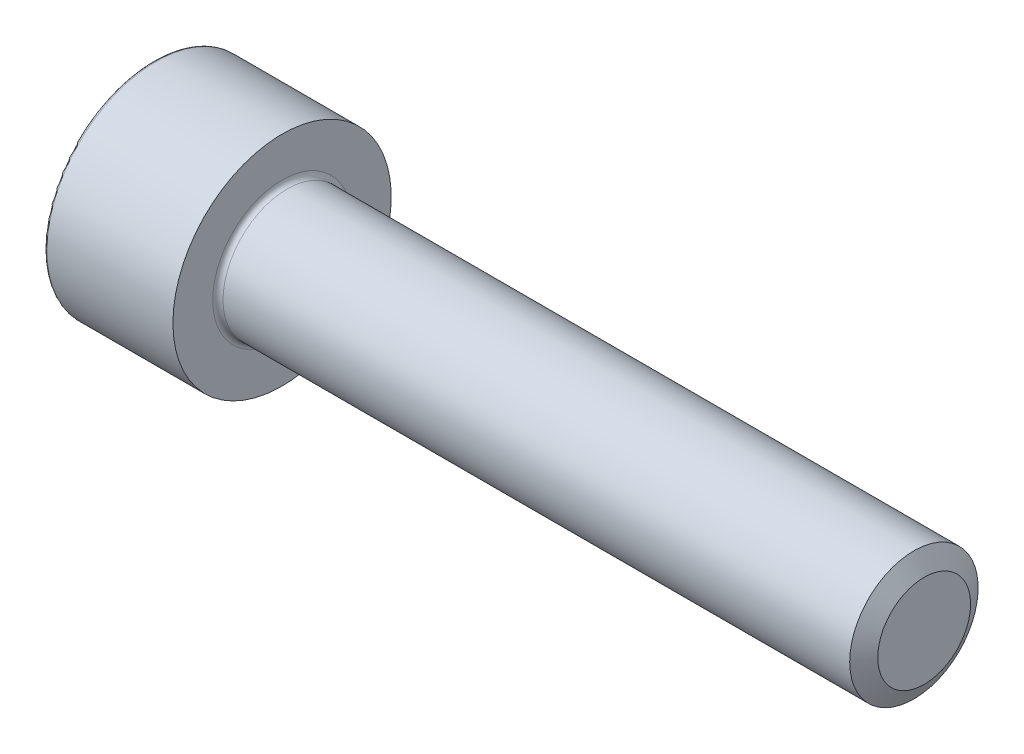
ISO-10303-21;
HEADER;
FILE_DESCRIPTION(('STEP AP214'),'2;1');
FILE_NAME('part.step','',(''),(''),'','','');
FILE_SCHEMA(('AUTOMOTIVE_DESIGN { 1 0 10303 214 1 1 1 1 }'));
ENDSEC;
DATA;
#1=APPLICATION_CONTEXT('core data for automotive mechanical design processes');
#2=APPLICATION_PROTOCOL_DEFINITION('international standard','automotive_design',2000,#1);
#3=PRODUCT_CONTEXT('',#1,'mechanical');
#4=PRODUCT('Part','Part','',(#3));
#5=PRODUCT_RELATED_PRODUCT_CATEGORY('part','',(#4));
#6=PRODUCT_DEFINITION_FORMATION('','',#4);
#7=PRODUCT_DEFINITION_CONTEXT('part definition',#1,'design');
#8=PRODUCT_DEFINITION('design','',#6,#7);
#9=PRODUCT_DEFINITION_SHAPE('','',#8);
#10=(LENGTH_UNIT() NAMED_UNIT(*) SI_UNIT(.MILLI.,.METRE.));
#11=(NAMED_UNIT(*) PLANE_ANGLE_UNIT() SI_UNIT($,.RADIAN.));
#12=(NAMED_UNIT(*) SI_UNIT($,.STERADIAN.) SOLID_ANGLE_UNIT());
#13=UNCERTAINTY_MEASURE_WITH_UNIT(LENGTH_MEASURE(1.E-05),#10,'distance_accuracy_value','');
#14=(GEOMETRIC_REPRESENTATION_CONTEXT(3) GLOBAL_UNCERTAINTY_ASSIGNED_CONTEXT((#13)) GLOBAL_UNIT_ASSIGNED_CONTEXT((#10,
#11,#12)) REPRESENTATION_CONTEXT('',''));
#15=CARTESIAN_POINT('',(0.,0.,0.));
#16=DIRECTION('',(0.,0.,1.));
#17=DIRECTION('',(1.,0.,0.));
#18=AXIS2_PLACEMENT_3D('',#15,#16,#17);
#19=CARTESIAN_POINT('',(0.,0.,0.));
#20=DIRECTION('',(-1.,0.,0.));
#21=DIRECTION('',(0.,0.,1.));
#22=AXIS2_PLACEMENT_3D('',#19,#20,#21);
#23=CYLINDRICAL_SURFACE('',#22,2.5);
#24=CARTESIAN_POINT('',(5.2,0.,0.));
#25=DIRECTION('',(-1.,0.,0.));
#26=DIRECTION('',(0.,0.,1.));
#27=AXIS2_PLACEMENT_3D('',#24,#25,#26);
#28=CIRCLE('',#27,2.5);
#29=CARTESIAN_POINT('',(5.2,0.,2.5));
#30=VERTEX_POINT('',#29);
#31=EDGE_CURVE('E142',#30,#30,#28,.T.);
#32=ORIENTED_EDGE('',*,*,#31,.F.);
#33=EDGE_LOOP('',(#32));
#34=FACE_BOUND('',#33,.T.);
#35=CARTESIAN_POINT('',(29.6000117335054,0.,0.));
#36=DIRECTION('',(-1.,0.,0.));
#37=DIRECTION('',(0.,0.,1.));
#38=AXIS2_PLACEMENT_3D('',#35,#36,#37);
#39=CIRCLE('',#38,2.5);
#40=CARTESIAN_POINT('',(29.6000117335054,0.,2.5));
#41=VERTEX_POINT('',#40);
#42=EDGE_CURVE('E279',#41,#41,#39,.T.);
#43=ORIENTED_EDGE('',*,*,#42,.T.);
#44=EDGE_LOOP('',(#43));
#45=FACE_BOUND('',#44,.T.);
#46=ADVANCED_FACE('F39',(#34,#45),#23,.T.);
#47=CARTESIAN_POINT('',(0.,0.,0.));
#48=DIRECTION('',(1.,0.,0.));
#49=DIRECTION('',(0.,0.,-1.));
#50=AXIS2_PLACEMENT_3D('',#47,#48,#49);
#51=PLANE('',#50);
#52=CARTESIAN_POINT('',(0.,0.,0.));
#53=DIRECTION('',(1.,0.,0.));
#54=DIRECTION('',(0.,0.,-1.));
#55=AXIS2_PLACEMENT_3D('',#52,#53,#54);
#56=CIRCLE('',#55,4.15);
#57=CARTESIAN_POINT('',(0.,0.,-4.15));
#58=VERTEX_POINT('',#57);
#59=EDGE_CURVE('E47',#58,#58,#56,.F.);
#60=ORIENTED_EDGE('',*,*,#59,.T.);
#61=EDGE_LOOP('',(#60));
#62=FACE_BOUND('',#61,.T.);
#63=DIRECTION('',(0.,0.866025403784439,-0.5));
#64=VECTOR('',#63,1.);
#65=CARTESIAN_POINT('',(0.,0.,2.29));
#66=LINE('',#65,#64);
#67=CARTESIAN_POINT('',(0.,0.,2.29));
#68=VERTEX_POINT('',#67);
#69=CARTESIAN_POINT('',(0.,1.98319817466637,1.145));
#70=VERTEX_POINT('',#69);
#71=EDGE_CURVE('E128',#68,#70,#66,.T.);
#72=ORIENTED_EDGE('',*,*,#71,.F.);
#73=DIRECTION('',(0.,0.866025403784439,0.5));
#74=VECTOR('',#73,1.);
#75=CARTESIAN_POINT('',(0.,-1.98319817466637,1.145));
#76=LINE('',#75,#74);
#77=CARTESIAN_POINT('',(0.,-1.98319817466637,1.145));
#78=VERTEX_POINT('',#77);
#79=EDGE_CURVE('E54',#78,#68,#76,.T.);
#80=ORIENTED_EDGE('',*,*,#79,.F.);
#81=DIRECTION('',(0.,0.,1.));
#82=VECTOR('',#81,1.);
#83=CARTESIAN_POINT('',(0.,-1.98319817466636,-1.145));
#84=LINE('',#83,#82);
#85=CARTESIAN_POINT('',(0.,-1.98319817466636,-1.145));
#86=VERTEX_POINT('',#85);
#87=EDGE_CURVE('E138',#86,#78,#84,.T.);
#88=ORIENTED_EDGE('',*,*,#87,.F.);
#89=DIRECTION('',(0.,-0.866025403784438,0.5));
#90=VECTOR('',#89,1.);
#91=CARTESIAN_POINT('',(0.,0.,-2.29));
#92=LINE('',#91,#90);
#93=CARTESIAN_POINT('',(0.,0.,-2.29));
#94=VERTEX_POINT('',#93);
#95=EDGE_CURVE('E136',#94,#86,#92,.T.);
#96=ORIENTED_EDGE('',*,*,#95,.F.);
#97=DIRECTION('',(0.,-0.866025403784439,-0.5));
#98=VECTOR('',#97,1.);
#99=CARTESIAN_POINT('',(0.,1.98319817466636,-1.145));
#100=LINE('',#99,#98);
#101=CARTESIAN_POINT('',(0.,1.98319817466636,-1.145));
#102=VERTEX_POINT('',#101);
#103=EDGE_CURVE('E102',#102,#94,#100,.T.);
#104=ORIENTED_EDGE('',*,*,#103,.F.);
#105=DIRECTION('',(0.,0.,-1.));
#106=VECTOR('',#105,1.);
#107=CARTESIAN_POINT('',(0.,1.98319817466637,1.145));
#108=LINE('',#107,#106);
#109=EDGE_CURVE('E132',#70,#102,#108,.T.);
#110=ORIENTED_EDGE('',*,*,#109,.F.);
#111=EDGE_LOOP('',(#72,#80,#88,#96,#104,#110));
#112=FACE_BOUND('',#111,.T.);
#113=ADVANCED_FACE('F159',(#62,#112),#51,.F.);
#114=CARTESIAN_POINT('',(0.,0.,0.));
#115=DIRECTION('',(-1.,0.,0.));
#116=DIRECTION('',(0.,0.,1.));
#117=AXIS2_PLACEMENT_3D('',#114,#115,#116);
#118=CYLINDRICAL_SURFACE('',#117,4.25);
#119=CARTESIAN_POINT('',(0.1,0.,0.));
#120=DIRECTION('',(1.,0.,0.));
#121=DIRECTION('',(0.,0.,-1.));
#122=AXIS2_PLACEMENT_3D('',#119,#120,#121);
#123=CIRCLE('',#122,4.25);
#124=CARTESIAN_POINT('',(0.1,0.,-4.25));
#125=VERTEX_POINT('',#124);
#126=EDGE_CURVE('E11',#125,#125,#123,.T.);
#127=ORIENTED_EDGE('',*,*,#126,.T.);
#128=EDGE_LOOP('',(#127));
#129=FACE_BOUND('',#128,.T.);
#130=CARTESIAN_POINT('',(5.,0.,0.));
#131=DIRECTION('',(-1.,0.,0.));
#132=DIRECTION('',(0.,0.,1.));
#133=AXIS2_PLACEMENT_3D('',#130,#131,#132);
#134=CIRCLE('',#133,4.25);
#135=CARTESIAN_POINT('',(5.,0.,4.25));
#136=VERTEX_POINT('',#135);
#137=EDGE_CURVE('E153',#136,#136,#134,.T.);
#138=ORIENTED_EDGE('',*,*,#137,.T.);
#139=EDGE_LOOP('',(#138));
#140=FACE_BOUND('',#139,.T.);
#141=ADVANCED_FACE('F178',(#129,#140),#118,.T.);
#142=CARTESIAN_POINT('',(5.,4.25,0.));
#143=DIRECTION('',(-1.,0.,0.));
#144=DIRECTION('',(0.,0.,1.));
#145=AXIS2_PLACEMENT_3D('',#142,#143,#144);
#146=PLANE('',#145);
#147=ORIENTED_EDGE('',*,*,#137,.F.);
#148=EDGE_LOOP('',(#147));
#149=FACE_BOUND('',#148,.T.);
#150=CARTESIAN_POINT('',(5.,0.,0.));
#151=DIRECTION('',(-1.,0.,0.));
#152=DIRECTION('',(0.,0.,1.));
#153=AXIS2_PLACEMENT_3D('',#150,#151,#152);
#154=CIRCLE('',#153,2.7);
#155=CARTESIAN_POINT('',(5.,0.,2.7));
#156=VERTEX_POINT('',#155);
#157=EDGE_CURVE('E150',#156,#156,#154,.T.);
#158=ORIENTED_EDGE('',*,*,#157,.T.);
#159=EDGE_LOOP('',(#158));
#160=FACE_BOUND('',#159,.T.);
#161=ADVANCED_FACE('F187',(#149,#160),#146,.F.);
#162=CARTESIAN_POINT('',(5.2,0.,0.));
#163=DIRECTION('',(-1.,0.,0.));
#164=DIRECTION('',(0.,0.,1.));
#165=AXIS2_PLACEMENT_3D('',#162,#163,#164);
#166=TOROIDAL_SURFACE('',#165,2.7,0.2);
#167=ORIENTED_EDGE('',*,*,#157,.F.);
#168=EDGE_LOOP('',(#167));
#169=FACE_BOUND('',#168,.T.);
#170=ORIENTED_EDGE('',*,*,#31,.T.);
#171=EDGE_LOOP('',(#170));
#172=FACE_BOUND('',#171,.T.);
#173=ADVANCED_FACE('F183',(#169,#172),#166,.F.);
#174=CARTESIAN_POINT('',(2.5,-1.98319817466637,1.145));
#175=DIRECTION('',(0.,-0.5,0.866025403784439));
#176=DIRECTION('',(0.,-0.866025403784439,-0.5));
#177=AXIS2_PLACEMENT_3D('',#174,#175,#176);
#178=PLANE('',#177);
#179=ORIENTED_EDGE('',*,*,#79,.T.);
#180=DIRECTION('',(-1.,0.,0.));
#181=VECTOR('',#180,1.);
#182=CARTESIAN_POINT('',(2.5,0.,2.29));
#183=LINE('',#182,#181);
#184=CARTESIAN_POINT('',(2.5,0.,2.29));
#185=VERTEX_POINT('',#184);
#186=EDGE_CURVE('E84',#185,#68,#183,.T.);
#187=ORIENTED_EDGE('',*,*,#186,.F.);
#188=DIRECTION('',(0.,0.866025403784439,0.5));
#189=VECTOR('',#188,1.);
#190=CARTESIAN_POINT('',(2.5,-1.98319817466637,1.145));
#191=LINE('',#190,#189);
#192=CARTESIAN_POINT('',(2.5,-1.98319817466637,1.145));
#193=VERTEX_POINT('',#192);
#194=EDGE_CURVE('E140',#193,#185,#191,.T.);
#195=ORIENTED_EDGE('',*,*,#194,.F.);
#196=DIRECTION('',(-1.,0.,0.));
#197=VECTOR('',#196,1.);
#198=CARTESIAN_POINT('',(2.5,-1.98319817466637,1.145));
#199=LINE('',#198,#197);
#200=EDGE_CURVE('E62',#193,#78,#199,.T.);
#201=ORIENTED_EDGE('',*,*,#200,.T.);
#202=EDGE_LOOP('',(#179,#187,#195,#201));
#203=FACE_BOUND('',#202,.T.);
#204=ADVANCED_FACE('F186',(#203),#178,.F.);
#205=CARTESIAN_POINT('',(2.5,-1.98319817466636,-1.145));
#206=DIRECTION('',(0.,-1.,0.));
#207=DIRECTION('',(0.,0.,-1.));
#208=AXIS2_PLACEMENT_3D('',#205,#206,#207);
#209=PLANE('',#208);
#210=ORIENTED_EDGE('',*,*,#87,.T.);
#211=ORIENTED_EDGE('',*,*,#200,.F.);
#212=DIRECTION('',(0.,0.,1.));
#213=VECTOR('',#212,1.);
#214=CARTESIAN_POINT('',(2.5,-1.98319817466636,-1.145));
#215=LINE('',#214,#213);
#216=CARTESIAN_POINT('',(2.5,-1.98319817466636,-1.145));
#217=VERTEX_POINT('',#216);
#218=EDGE_CURVE('E114',#217,#193,#215,.T.);
#219=ORIENTED_EDGE('',*,*,#218,.F.);
#220=DIRECTION('',(-1.,0.,0.));
#221=VECTOR('',#220,1.);
#222=CARTESIAN_POINT('',(2.5,-1.98319817466636,-1.145));
#223=LINE('',#222,#221);
#224=EDGE_CURVE('E106',#217,#86,#223,.T.);
#225=ORIENTED_EDGE('',*,*,#224,.T.);
#226=EDGE_LOOP('',(#210,#211,#219,#225));
#227=FACE_BOUND('',#226,.T.);
#228=ADVANCED_FACE('F217',(#227),#209,.F.);
#229=CARTESIAN_POINT('',(2.5,0.,-2.29));
#230=DIRECTION('',(0.,-0.5,-0.866025403784439));
#231=DIRECTION('',(0.,0.866025403784439,-0.5));
#232=AXIS2_PLACEMENT_3D('',#229,#230,#231);
#233=PLANE('',#232);
#234=ORIENTED_EDGE('',*,*,#95,.T.);
#235=ORIENTED_EDGE('',*,*,#224,.F.);
#236=DIRECTION('',(0.,-0.866025403784438,0.5));
#237=VECTOR('',#236,1.);
#238=CARTESIAN_POINT('',(2.5,0.,-2.29));
#239=LINE('',#238,#237);
#240=CARTESIAN_POINT('',(2.5,0.,-2.29));
#241=VERTEX_POINT('',#240);
#242=EDGE_CURVE('E110',#241,#217,#239,.T.);
#243=ORIENTED_EDGE('',*,*,#242,.F.);
#244=DIRECTION('',(-1.,0.,0.));
#245=VECTOR('',#244,1.);
#246=CARTESIAN_POINT('',(2.5,0.,-2.29));
#247=LINE('',#246,#245);
#248=EDGE_CURVE('E95',#241,#94,#247,.T.);
#249=ORIENTED_EDGE('',*,*,#248,.T.);
#250=EDGE_LOOP('',(#234,#235,#243,#249));
#251=FACE_BOUND('',#250,.T.);
#252=ADVANCED_FACE('F111',(#251),#233,.F.);
#253=CARTESIAN_POINT('',(2.5,1.98319817466636,-1.145));
#254=DIRECTION('',(0.,0.5,-0.866025403784439));
#255=DIRECTION('',(0.,0.866025403784439,0.5));
#256=AXIS2_PLACEMENT_3D('',#253,#254,#255);
#257=PLANE('',#256);
#258=ORIENTED_EDGE('',*,*,#103,.T.);
#259=ORIENTED_EDGE('',*,*,#248,.F.);
#260=DIRECTION('',(0.,-0.866025403784439,-0.5));
#261=VECTOR('',#260,1.);
#262=CARTESIAN_POINT('',(2.5,1.98319817466636,-1.145));
#263=LINE('',#262,#261);
#264=CARTESIAN_POINT('',(2.5,1.98319817466636,-1.145));
#265=VERTEX_POINT('',#264);
#266=EDGE_CURVE('E99',#265,#241,#263,.T.);
#267=ORIENTED_EDGE('',*,*,#266,.F.);
#268=DIRECTION('',(-1.,0.,0.));
#269=VECTOR('',#268,1.);
#270=CARTESIAN_POINT('',(2.5,1.98319817466636,-1.145));
#271=LINE('',#270,#269);
#272=EDGE_CURVE('E107',#265,#102,#271,.T.);
#273=ORIENTED_EDGE('',*,*,#272,.T.);
#274=EDGE_LOOP('',(#258,#259,#267,#273));
#275=FACE_BOUND('',#274,.T.);
#276=ADVANCED_FACE('F97',(#275),#257,.F.);
#277=CARTESIAN_POINT('',(2.5,1.98319817466637,1.145));
#278=DIRECTION('',(0.,1.,0.));
#279=DIRECTION('',(0.,0.,1.));
#280=AXIS2_PLACEMENT_3D('',#277,#278,#279);
#281=PLANE('',#280);
#282=ORIENTED_EDGE('',*,*,#109,.T.);
#283=ORIENTED_EDGE('',*,*,#272,.F.);
#284=DIRECTION('',(0.,0.,-1.));
#285=VECTOR('',#284,1.);
#286=CARTESIAN_POINT('',(2.5,1.98319817466637,1.145));
#287=LINE('',#286,#285);
#288=CARTESIAN_POINT('',(2.5,1.98319817466637,1.145));
#289=VERTEX_POINT('',#288);
#290=EDGE_CURVE('E120',#289,#265,#287,.T.);
#291=ORIENTED_EDGE('',*,*,#290,.F.);
#292=DIRECTION('',(-1.,0.,0.));
#293=VECTOR('',#292,1.);
#294=CARTESIAN_POINT('',(2.5,1.98319817466637,1.145));
#295=LINE('',#294,#293);
#296=EDGE_CURVE('E145',#289,#70,#295,.T.);
#297=ORIENTED_EDGE('',*,*,#296,.T.);
#298=EDGE_LOOP('',(#282,#283,#291,#297));
#299=FACE_BOUND('',#298,.T.);
#300=ADVANCED_FACE('F235',(#299),#281,.F.);
#301=CARTESIAN_POINT('',(2.5,0.,2.29));
#302=DIRECTION('',(0.,0.5,0.866025403784438));
#303=DIRECTION('',(0.,-0.866025403784438,0.5));
#304=AXIS2_PLACEMENT_3D('',#301,#302,#303);
#305=PLANE('',#304);
#306=ORIENTED_EDGE('',*,*,#71,.T.);
#307=ORIENTED_EDGE('',*,*,#296,.F.);
#308=DIRECTION('',(0.,0.866025403784439,-0.5));
#309=VECTOR('',#308,1.);
#310=CARTESIAN_POINT('',(2.5,0.,2.29));
#311=LINE('',#310,#309);
#312=EDGE_CURVE('E122',#185,#289,#311,.T.);
#313=ORIENTED_EDGE('',*,*,#312,.F.);
#314=ORIENTED_EDGE('',*,*,#186,.T.);
#315=EDGE_LOOP('',(#306,#307,#313,#314));
#316=FACE_BOUND('',#315,.T.);
#317=ADVANCED_FACE('F242',(#316),#305,.F.);
#318=CARTESIAN_POINT('',(2.5,-1.98319817466637,1.145));
#319=DIRECTION('',(1.,0.,0.));
#320=DIRECTION('',(0.,0.,-1.));
#321=AXIS2_PLACEMENT_3D('',#318,#319,#320);
#322=PLANE('',#321);
#323=ORIENTED_EDGE('',*,*,#194,.T.);
#324=ORIENTED_EDGE('',*,*,#312,.T.);
#325=ORIENTED_EDGE('',*,*,#290,.T.);
#326=ORIENTED_EDGE('',*,*,#266,.T.);
#327=ORIENTED_EDGE('',*,*,#242,.T.);
#328=ORIENTED_EDGE('',*,*,#218,.T.);
#329=EDGE_LOOP('',(#323,#324,#325,#326,#327,#328));
#330=FACE_BOUND('',#329,.T.);
#331=ADVANCED_FACE('F117',(#330),#322,.F.);
#332=CARTESIAN_POINT('',(29.6000117335054,0.,0.));
#333=DIRECTION('',(-1.,0.,0.));
#334=DIRECTION('',(0.,0.,1.));
#335=AXIS2_PLACEMENT_3D('',#332,#333,#334);
#336=CONICAL_SURFACE('',#335,2.5,1.04719755119659);
#337=CARTESIAN_POINT('',(30.,0.,0.));
#338=DIRECTION('',(-1.,0.,0.));
#339=DIRECTION('',(0.,0.,1.));
#340=AXIS2_PLACEMENT_3D('',#337,#338,#339);
#341=CIRCLE('',#340,1.8072);
#342=CARTESIAN_POINT('',(30.,0.,1.8072));
#343=VERTEX_POINT('',#342);
#344=EDGE_CURVE('E129',#343,#343,#341,.T.);
#345=ORIENTED_EDGE('',*,*,#344,.T.);
#346=EDGE_LOOP('',(#345));
#347=FACE_BOUND('',#346,.T.);
#348=ORIENTED_EDGE('',*,*,#42,.F.);
#349=EDGE_LOOP('',(#348));
#350=FACE_BOUND('',#349,.T.);
#351=ADVANCED_FACE('F168',(#347,#350),#336,.T.);
#352=CARTESIAN_POINT('',(30.,2.5,0.));
#353=DIRECTION('',(-1.,0.,0.));
#354=DIRECTION('',(0.,0.,1.));
#355=AXIS2_PLACEMENT_3D('',#352,#353,#354);
#356=PLANE('',#355);
#357=ORIENTED_EDGE('',*,*,#344,.F.);
#358=EDGE_LOOP('',(#357));
#359=FACE_BOUND('',#358,.T.);
#360=ADVANCED_FACE('F163',(#359),#356,.F.);
#361=CARTESIAN_POINT('',(0.1,0.,0.));
#362=DIRECTION('',(1.,0.,0.));
#363=DIRECTION('',(0.,0.,-1.));
#364=AXIS2_PLACEMENT_3D('',#361,#362,#363);
#365=TOROIDAL_SURFACE('',#364,4.15,0.1);
#366=ORIENTED_EDGE('',*,*,#126,.F.);
#367=EDGE_LOOP('',(#366));
#368=FACE_BOUND('',#367,.T.);
#369=ORIENTED_EDGE('',*,*,#59,.F.);
#370=EDGE_LOOP('',(#369));
#371=FACE_BOUND('',#370,.T.);
#372=ADVANCED_FACE('F41',(#368,#371),#365,.T.);
#373=CLOSED_SHELL('',(#46,#113,#141,#161,#173,#204,#228,#252,#276,#300,#317,#331,#351,#360,#372));
#374=MANIFOLD_SOLID_BREP('B2',#373);
#375=ADVANCED_BREP_SHAPE_REPRESENTATION('',(#18,#374),#14);
#376=SHAPE_DEFINITION_REPRESENTATION(#9,#375);
ENDSEC;
END-ISO-10303-21;
